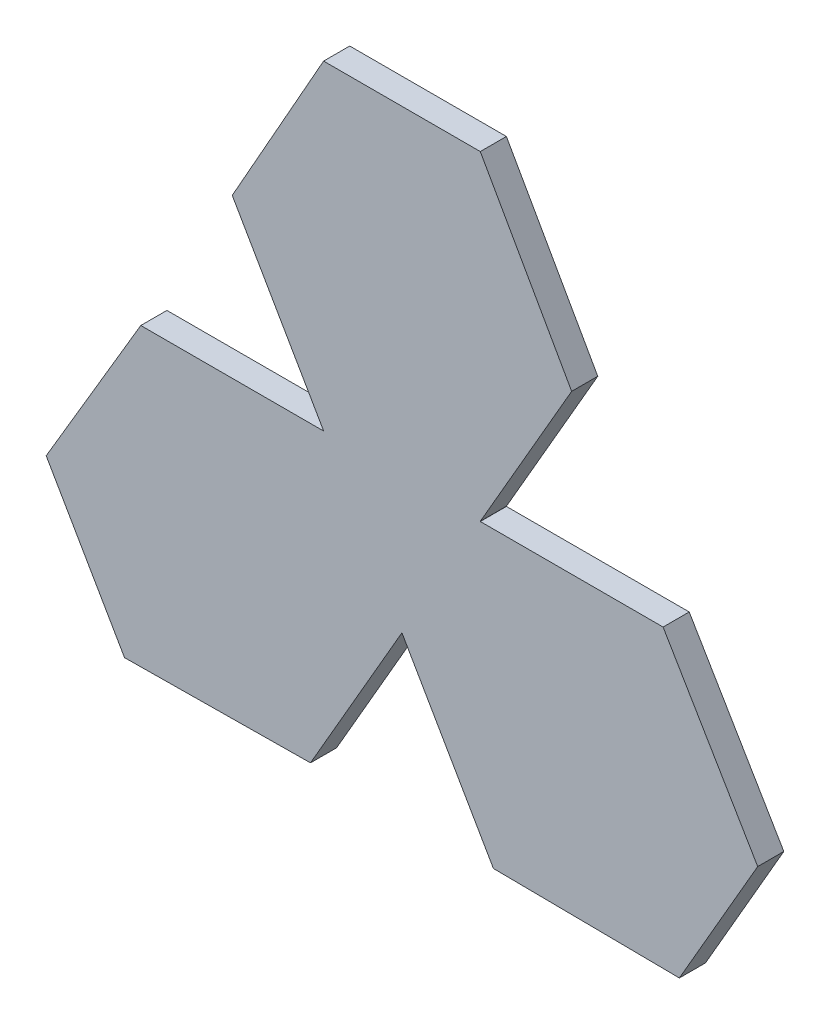
ISO-10303-21;
HEADER;
FILE_DESCRIPTION(('STEP AP214'),'2;1');
FILE_NAME('part.step','',(''),(''),'','','');
FILE_SCHEMA(('AUTOMOTIVE_DESIGN { 1 0 10303 214 1 1 1 1 }'));
ENDSEC;
DATA;
#1=APPLICATION_CONTEXT('core data for automotive mechanical design processes');
#2=APPLICATION_PROTOCOL_DEFINITION('international standard','automotive_design',2000,#1);
#3=PRODUCT_CONTEXT('',#1,'mechanical');
#4=PRODUCT('Part','Part','',(#3));
#5=PRODUCT_RELATED_PRODUCT_CATEGORY('part','',(#4));
#6=PRODUCT_DEFINITION_FORMATION('','',#4);
#7=PRODUCT_DEFINITION_CONTEXT('part definition',#1,'design');
#8=PRODUCT_DEFINITION('design','',#6,#7);
#9=PRODUCT_DEFINITION_SHAPE('','',#8);
#10=(LENGTH_UNIT() NAMED_UNIT(*) SI_UNIT(.MILLI.,.METRE.));
#11=(NAMED_UNIT(*) PLANE_ANGLE_UNIT() SI_UNIT($,.RADIAN.));
#12=(NAMED_UNIT(*) SI_UNIT($,.STERADIAN.) SOLID_ANGLE_UNIT());
#13=UNCERTAINTY_MEASURE_WITH_UNIT(LENGTH_MEASURE(1.E-05),#10,'distance_accuracy_value','');
#14=(GEOMETRIC_REPRESENTATION_CONTEXT(3) GLOBAL_UNCERTAINTY_ASSIGNED_CONTEXT((#13)) GLOBAL_UNIT_ASSIGNED_CONTEXT((#10,
#11,#12)) REPRESENTATION_CONTEXT('',''));
#15=CARTESIAN_POINT('',(0.,0.,0.));
#16=DIRECTION('',(0.,0.,1.));
#17=DIRECTION('',(1.,0.,0.));
#18=AXIS2_PLACEMENT_3D('',#15,#16,#17);
#19=CARTESIAN_POINT('',(-15.005,8.65159378380653,5.));
#20=DIRECTION('',(0.,-1.,0.));
#21=DIRECTION('',(1.,0.,0.));
#22=AXIS2_PLACEMENT_3D('',#19,#20,#21);
#23=PLANE('',#22);
#24=DIRECTION('',(-1.,0.,0.));
#25=VECTOR('',#24,1.);
#26=CARTESIAN_POINT('',(-15.005,8.65159378380653,0.));
#27=LINE('',#26,#25);
#28=CARTESIAN_POINT('',(-15.005,8.65159378380653,0.));
#29=VERTEX_POINT('',#28);
#30=CARTESIAN_POINT('',(-50.005,8.65159378380644,0.));
#31=VERTEX_POINT('',#30);
#32=EDGE_CURVE('E208',#29,#31,#27,.T.);
#33=ORIENTED_EDGE('',*,*,#32,.T.);
#34=DIRECTION('',(0.,0.,-1.));
#35=VECTOR('',#34,1.);
#36=CARTESIAN_POINT('',(-50.005,8.65159378380644,5.));
#37=LINE('',#36,#35);
#38=CARTESIAN_POINT('',(-50.005,8.65159378380644,5.));
#39=VERTEX_POINT('',#38);
#40=EDGE_CURVE('E52',#39,#31,#37,.T.);
#41=ORIENTED_EDGE('',*,*,#40,.F.);
#42=DIRECTION('',(-1.,0.,0.));
#43=VECTOR('',#42,1.);
#44=CARTESIAN_POINT('',(-15.005,8.65159378380653,5.));
#45=LINE('',#44,#43);
#46=CARTESIAN_POINT('',(-15.005,8.65159378380653,5.));
#47=VERTEX_POINT('',#46);
#48=EDGE_CURVE('E134',#47,#39,#45,.T.);
#49=ORIENTED_EDGE('',*,*,#48,.F.);
#50=DIRECTION('',(0.,0.,-1.));
#51=VECTOR('',#50,1.);
#52=CARTESIAN_POINT('',(-15.005,8.65159378380653,5.));
#53=LINE('',#52,#51);
#54=EDGE_CURVE('E11',#47,#29,#53,.T.);
#55=ORIENTED_EDGE('',*,*,#54,.T.);
#56=EDGE_LOOP('',(#33,#41,#49,#55));
#57=FACE_BOUND('',#56,.T.);
#58=ADVANCED_FACE('F43',(#57),#23,.F.);
#59=CARTESIAN_POINT('',(-50.005,8.65159378380644,5.));
#60=DIRECTION('',(0.860941421721352,-0.508704106887704,0.));
#61=DIRECTION('',(0.508704106887704,0.860941421721352,0.));
#62=AXIS2_PLACEMENT_3D('',#59,#60,#61);
#63=PLANE('',#62);
#64=DIRECTION('',(-0.508704106887704,-0.860941421721352,0.));
#65=VECTOR('',#64,1.);
#66=CARTESIAN_POINT('',(-50.005,8.65159378380644,0.));
#67=LINE('',#66,#65);
#68=CARTESIAN_POINT('',(-68.1217782649107,-22.0096189432335,0.));
#69=VERTEX_POINT('',#68);
#70=EDGE_CURVE('E211',#31,#69,#67,.T.);
#71=ORIENTED_EDGE('',*,*,#70,.T.);
#72=DIRECTION('',(0.,0.,-1.));
#73=VECTOR('',#72,1.);
#74=CARTESIAN_POINT('',(-68.1217782649107,-22.0096189432335,5.));
#75=LINE('',#74,#73);
#76=CARTESIAN_POINT('',(-68.1217782649107,-22.0096189432335,5.));
#77=VERTEX_POINT('',#76);
#78=EDGE_CURVE('E311',#77,#69,#75,.T.);
#79=ORIENTED_EDGE('',*,*,#78,.F.);
#80=DIRECTION('',(-0.508704106887704,-0.860941421721352,0.));
#81=VECTOR('',#80,1.);
#82=CARTESIAN_POINT('',(-50.005,8.65159378380644,5.));
#83=LINE('',#82,#81);
#84=EDGE_CURVE('E321',#39,#77,#83,.T.);
#85=ORIENTED_EDGE('',*,*,#84,.F.);
#86=ORIENTED_EDGE('',*,*,#40,.T.);
#87=EDGE_LOOP('',(#71,#79,#85,#86));
#88=FACE_BOUND('',#87,.T.);
#89=ADVANCED_FACE('F319',(#88),#63,.F.);
#90=CARTESIAN_POINT('',(-68.1217782649107,-22.0096189432335,5.));
#91=DIRECTION('',(0.866025403784438,0.5,0.));
#92=DIRECTION('',(-0.5,0.866025403784438,0.));
#93=AXIS2_PLACEMENT_3D('',#90,#91,#92);
#94=PLANE('',#93);
#95=DIRECTION('',(0.5,-0.866025403784438,0.));
#96=VECTOR('',#95,1.);
#97=CARTESIAN_POINT('',(-68.1217782649107,-22.0096189432335,0.));
#98=LINE('',#97,#96);
#99=CARTESIAN_POINT('',(-53.1217782649107,-47.9903810567666,0.));
#100=VERTEX_POINT('',#99);
#101=EDGE_CURVE('E214',#69,#100,#98,.T.);
#102=ORIENTED_EDGE('',*,*,#101,.T.);
#103=DIRECTION('',(0.,0.,-1.));
#104=VECTOR('',#103,1.);
#105=CARTESIAN_POINT('',(-53.1217782649107,-47.9903810567666,5.));
#106=LINE('',#105,#104);
#107=CARTESIAN_POINT('',(-53.1217782649107,-47.9903810567666,5.));
#108=VERTEX_POINT('',#107);
#109=EDGE_CURVE('E307',#108,#100,#106,.T.);
#110=ORIENTED_EDGE('',*,*,#109,.F.);
#111=DIRECTION('',(0.5,-0.866025403784438,0.));
#112=VECTOR('',#111,1.);
#113=CARTESIAN_POINT('',(-68.1217782649107,-22.0096189432335,5.));
#114=LINE('',#113,#112);
#115=EDGE_CURVE('E341',#77,#108,#114,.T.);
#116=ORIENTED_EDGE('',*,*,#115,.F.);
#117=ORIENTED_EDGE('',*,*,#78,.T.);
#118=EDGE_LOOP('',(#102,#110,#116,#117));
#119=FACE_BOUND('',#118,.T.);
#120=ADVANCED_FACE('F331',(#119),#94,.F.);
#121=CARTESIAN_POINT('',(-17.5100000000001,-47.6313972081441,5.));
#122=DIRECTION('',(-0.010079968713551,0.999949195824835,0.));
#123=DIRECTION('',(-0.999949195824835,-0.010079968713551,0.));
#124=AXIS2_PLACEMENT_3D('',#121,#122,#123);
#125=PLANE('',#124);
#126=DIRECTION('',(0.999949195824835,0.010079968713551,0.));
#127=VECTOR('',#126,1.);
#128=CARTESIAN_POINT('',(-17.5100000000001,-47.6313972081441,0.));
#129=LINE('',#128,#127);
#130=CARTESIAN_POINT('',(-17.5100000000001,-47.6313972081441,0.));
#131=VERTEX_POINT('',#130);
#132=EDGE_CURVE('E217',#100,#131,#129,.T.);
#133=ORIENTED_EDGE('',*,*,#132,.T.);
#134=DIRECTION('',(0.,0.,-1.));
#135=VECTOR('',#134,1.);
#136=CARTESIAN_POINT('',(-17.5100000000001,-47.6313972081441,5.));
#137=LINE('',#136,#135);
#138=CARTESIAN_POINT('',(-17.5100000000001,-47.6313972081441,5.));
#139=VERTEX_POINT('',#138);
#140=EDGE_CURVE('E303',#139,#131,#137,.T.);
#141=ORIENTED_EDGE('',*,*,#140,.F.);
#142=DIRECTION('',(0.999949195824835,0.010079968713551,0.));
#143=VECTOR('',#142,1.);
#144=CARTESIAN_POINT('',(-17.5100000000001,-47.6313972081441,5.));
#145=LINE('',#144,#143);
#146=EDGE_CURVE('E337',#108,#139,#145,.T.);
#147=ORIENTED_EDGE('',*,*,#146,.F.);
#148=ORIENTED_EDGE('',*,*,#109,.T.);
#149=EDGE_LOOP('',(#133,#141,#147,#148));
#150=FACE_BOUND('',#149,.T.);
#151=ADVANCED_FACE('F335',(#150),#125,.F.);
#152=CARTESIAN_POINT('',(-0.00999999999999439,-17.3205080756888,5.));
#153=DIRECTION('',(-0.866025403784438,0.500000000000002,0.));
#154=DIRECTION('',(-0.500000000000002,-0.866025403784438,0.));
#155=AXIS2_PLACEMENT_3D('',#152,#153,#154);
#156=PLANE('',#155);
#157=DIRECTION('',(0.500000000000002,0.866025403784438,0.));
#158=VECTOR('',#157,1.);
#159=CARTESIAN_POINT('',(-0.00999999999999439,-17.3205080756888,0.));
#160=LINE('',#159,#158);
#161=CARTESIAN_POINT('',(-0.00999999999999439,-17.3205080756888,0.));
#162=VERTEX_POINT('',#161);
#163=EDGE_CURVE('E220',#131,#162,#160,.T.);
#164=ORIENTED_EDGE('',*,*,#163,.T.);
#165=DIRECTION('',(0.,0.,-1.));
#166=VECTOR('',#165,1.);
#167=CARTESIAN_POINT('',(-0.00999999999999439,-17.3205080756888,5.));
#168=LINE('',#167,#166);
#169=CARTESIAN_POINT('',(-0.00999999999999439,-17.3205080756888,5.));
#170=VERTEX_POINT('',#169);
#171=EDGE_CURVE('E299',#170,#162,#168,.T.);
#172=ORIENTED_EDGE('',*,*,#171,.F.);
#173=DIRECTION('',(0.500000000000002,0.866025403784438,0.));
#174=VECTOR('',#173,1.);
#175=CARTESIAN_POINT('',(-0.00999999999999439,-17.3205080756888,5.));
#176=LINE('',#175,#174);
#177=EDGE_CURVE('E340',#139,#170,#176,.T.);
#178=ORIENTED_EDGE('',*,*,#177,.F.);
#179=ORIENTED_EDGE('',*,*,#140,.T.);
#180=EDGE_LOOP('',(#164,#172,#178,#179));
#181=FACE_BOUND('',#180,.T.);
#182=ADVANCED_FACE('F409',(#181),#156,.F.);
#183=CARTESIAN_POINT('',(0.,-17.3205080756888,5.));
#184=DIRECTION('',(0.,1.,0.));
#185=DIRECTION('',(0.,0.,1.));
#186=AXIS2_PLACEMENT_3D('',#183,#184,#185);
#187=PLANE('',#186);
#188=DIRECTION('',(1.,0.,0.));
#189=VECTOR('',#188,1.);
#190=CARTESIAN_POINT('',(0.,-17.3205080756888,0.));
#191=LINE('',#190,#189);
#192=CARTESIAN_POINT('',(0.0100000000000096,-17.3205080756888,0.));
#193=VERTEX_POINT('',#192);
#194=EDGE_CURVE('E224',#162,#193,#191,.T.);
#195=ORIENTED_EDGE('',*,*,#194,.T.);
#196=DIRECTION('',(0.,0.,-1.));
#197=VECTOR('',#196,1.);
#198=CARTESIAN_POINT('',(0.0100000000000096,-17.3205080756888,5.));
#199=LINE('',#198,#197);
#200=CARTESIAN_POINT('',(0.0100000000000096,-17.3205080756888,5.));
#201=VERTEX_POINT('',#200);
#202=EDGE_CURVE('E295',#201,#193,#199,.T.);
#203=ORIENTED_EDGE('',*,*,#202,.F.);
#204=DIRECTION('',(1.,-3.46944695195342E-13,0.));
#205=VECTOR('',#204,1.);
#206=CARTESIAN_POINT('',(0.,-17.3205080756888,5.));
#207=LINE('',#206,#205);
#208=EDGE_CURVE('E345',#170,#201,#207,.T.);
#209=ORIENTED_EDGE('',*,*,#208,.F.);
#210=ORIENTED_EDGE('',*,*,#171,.T.);
#211=EDGE_LOOP('',(#195,#203,#209,#210));
#212=FACE_BOUND('',#211,.T.);
#213=ADVANCED_FACE('F412',(#212),#187,.F.);
#214=CARTESIAN_POINT('',(0.0100000000000096,-17.3205080756888,5.));
#215=DIRECTION('',(0.866025403784437,0.500000000000002,0.));
#216=DIRECTION('',(-0.500000000000002,0.866025403784437,0.));
#217=AXIS2_PLACEMENT_3D('',#214,#215,#216);
#218=PLANE('',#217);
#219=DIRECTION('',(0.500000000000002,-0.866025403784437,0.));
#220=VECTOR('',#219,1.);
#221=CARTESIAN_POINT('',(0.0100000000000096,-17.3205080756888,0.));
#222=LINE('',#221,#220);
#223=CARTESIAN_POINT('',(17.5100000000001,-47.6313972081441,0.));
#224=VERTEX_POINT('',#223);
#225=EDGE_CURVE('E227',#193,#224,#222,.T.);
#226=ORIENTED_EDGE('',*,*,#225,.T.);
#227=DIRECTION('',(0.,0.,-1.));
#228=VECTOR('',#227,1.);
#229=CARTESIAN_POINT('',(17.5100000000001,-47.6313972081441,5.));
#230=LINE('',#229,#228);
#231=CARTESIAN_POINT('',(17.5100000000001,-47.6313972081441,5.));
#232=VERTEX_POINT('',#231);
#233=EDGE_CURVE('E291',#232,#224,#230,.T.);
#234=ORIENTED_EDGE('',*,*,#233,.F.);
#235=DIRECTION('',(0.500000000000002,-0.866025403784437,0.));
#236=VECTOR('',#235,1.);
#237=CARTESIAN_POINT('',(0.0100000000000096,-17.3205080756888,5.));
#238=LINE('',#237,#236);
#239=EDGE_CURVE('E352',#201,#232,#238,.T.);
#240=ORIENTED_EDGE('',*,*,#239,.F.);
#241=ORIENTED_EDGE('',*,*,#202,.T.);
#242=EDGE_LOOP('',(#226,#234,#240,#241));
#243=FACE_BOUND('',#242,.T.);
#244=ADVANCED_FACE('F416',(#243),#218,.F.);
#245=CARTESIAN_POINT('',(17.5100000000001,-47.6313972081441,5.));
#246=DIRECTION('',(0.0100799687135502,0.999949195824835,0.));
#247=DIRECTION('',(-0.999949195824835,0.0100799687135502,0.));
#248=AXIS2_PLACEMENT_3D('',#245,#246,#247);
#249=PLANE('',#248);
#250=DIRECTION('',(0.999949195824835,-0.0100799687135502,0.));
#251=VECTOR('',#250,1.);
#252=CARTESIAN_POINT('',(17.5100000000001,-47.6313972081441,0.));
#253=LINE('',#252,#251);
#254=CARTESIAN_POINT('',(53.1217782649108,-47.9903810567666,0.));
#255=VERTEX_POINT('',#254);
#256=EDGE_CURVE('E230',#224,#255,#253,.T.);
#257=ORIENTED_EDGE('',*,*,#256,.T.);
#258=DIRECTION('',(0.,0.,-1.));
#259=VECTOR('',#258,1.);
#260=CARTESIAN_POINT('',(53.1217782649108,-47.9903810567666,5.));
#261=LINE('',#260,#259);
#262=CARTESIAN_POINT('',(53.1217782649108,-47.9903810567666,5.));
#263=VERTEX_POINT('',#262);
#264=EDGE_CURVE('E287',#263,#255,#261,.T.);
#265=ORIENTED_EDGE('',*,*,#264,.F.);
#266=DIRECTION('',(0.999949195824835,-0.0100799687135502,0.));
#267=VECTOR('',#266,1.);
#268=CARTESIAN_POINT('',(17.5100000000001,-47.6313972081441,5.));
#269=LINE('',#268,#267);
#270=EDGE_CURVE('E355',#232,#263,#269,.T.);
#271=ORIENTED_EDGE('',*,*,#270,.F.);
#272=ORIENTED_EDGE('',*,*,#233,.T.);
#273=EDGE_LOOP('',(#257,#265,#271,#272));
#274=FACE_BOUND('',#273,.T.);
#275=ADVANCED_FACE('F420',(#274),#249,.F.);
#276=CARTESIAN_POINT('',(53.1217782649108,-47.9903810567666,5.));
#277=DIRECTION('',(-0.866025403784439,0.5,0.));
#278=DIRECTION('',(-0.5,-0.866025403784439,0.));
#279=AXIS2_PLACEMENT_3D('',#276,#277,#278);
#280=PLANE('',#279);
#281=DIRECTION('',(0.5,0.866025403784439,0.));
#282=VECTOR('',#281,1.);
#283=CARTESIAN_POINT('',(53.1217782649108,-47.9903810567666,0.));
#284=LINE('',#283,#282);
#285=CARTESIAN_POINT('',(68.1217782649108,-22.0096189432334,0.));
#286=VERTEX_POINT('',#285);
#287=EDGE_CURVE('E233',#255,#286,#284,.T.);
#288=ORIENTED_EDGE('',*,*,#287,.T.);
#289=DIRECTION('',(0.,0.,-1.));
#290=VECTOR('',#289,1.);
#291=CARTESIAN_POINT('',(68.1217782649108,-22.0096189432334,5.));
#292=LINE('',#291,#290);
#293=CARTESIAN_POINT('',(68.1217782649108,-22.0096189432334,5.));
#294=VERTEX_POINT('',#293);
#295=EDGE_CURVE('E283',#294,#286,#292,.T.);
#296=ORIENTED_EDGE('',*,*,#295,.F.);
#297=DIRECTION('',(0.5,0.866025403784439,0.));
#298=VECTOR('',#297,1.);
#299=CARTESIAN_POINT('',(53.1217782649108,-47.9903810567666,5.));
#300=LINE('',#299,#298);
#301=EDGE_CURVE('E358',#263,#294,#300,.T.);
#302=ORIENTED_EDGE('',*,*,#301,.F.);
#303=ORIENTED_EDGE('',*,*,#264,.T.);
#304=EDGE_LOOP('',(#288,#296,#302,#303));
#305=FACE_BOUND('',#304,.T.);
#306=ADVANCED_FACE('F424',(#305),#280,.F.);
#307=CARTESIAN_POINT('',(50.005,8.65159378380647,5.));
#308=DIRECTION('',(-0.860941421721352,-0.508704106887705,0.));
#309=DIRECTION('',(0.508704106887705,-0.860941421721352,0.));
#310=AXIS2_PLACEMENT_3D('',#307,#308,#309);
#311=PLANE('',#310);
#312=DIRECTION('',(-0.508704106887705,0.860941421721352,0.));
#313=VECTOR('',#312,1.);
#314=CARTESIAN_POINT('',(50.005,8.65159378380647,0.));
#315=LINE('',#314,#313);
#316=CARTESIAN_POINT('',(50.005,8.65159378380647,0.));
#317=VERTEX_POINT('',#316);
#318=EDGE_CURVE('E236',#286,#317,#315,.T.);
#319=ORIENTED_EDGE('',*,*,#318,.T.);
#320=DIRECTION('',(0.,0.,-1.));
#321=VECTOR('',#320,1.);
#322=CARTESIAN_POINT('',(50.005,8.65159378380647,5.));
#323=LINE('',#322,#321);
#324=CARTESIAN_POINT('',(50.005,8.65159378380647,5.));
#325=VERTEX_POINT('',#324);
#326=EDGE_CURVE('E279',#325,#317,#323,.T.);
#327=ORIENTED_EDGE('',*,*,#326,.F.);
#328=DIRECTION('',(-0.508704106887705,0.860941421721352,0.));
#329=VECTOR('',#328,1.);
#330=CARTESIAN_POINT('',(50.005,8.65159378380647,5.));
#331=LINE('',#330,#329);
#332=EDGE_CURVE('E361',#294,#325,#331,.T.);
#333=ORIENTED_EDGE('',*,*,#332,.F.);
#334=ORIENTED_EDGE('',*,*,#295,.T.);
#335=EDGE_LOOP('',(#319,#327,#333,#334));
#336=FACE_BOUND('',#335,.T.);
#337=ADVANCED_FACE('F428',(#336),#311,.F.);
#338=CARTESIAN_POINT('',(15.005,8.65159378380654,5.));
#339=DIRECTION('',(0.,-1.,0.));
#340=DIRECTION('',(1.,0.,0.));
#341=AXIS2_PLACEMENT_3D('',#338,#339,#340);
#342=PLANE('',#341);
#343=DIRECTION('',(-1.,0.,0.));
#344=VECTOR('',#343,1.);
#345=CARTESIAN_POINT('',(15.005,8.65159378380654,0.));
#346=LINE('',#345,#344);
#347=CARTESIAN_POINT('',(15.005,8.65159378380654,0.));
#348=VERTEX_POINT('',#347);
#349=EDGE_CURVE('E239',#317,#348,#346,.T.);
#350=ORIENTED_EDGE('',*,*,#349,.T.);
#351=DIRECTION('',(0.,0.,-1.));
#352=VECTOR('',#351,1.);
#353=CARTESIAN_POINT('',(15.005,8.65159378380654,5.));
#354=LINE('',#353,#352);
#355=CARTESIAN_POINT('',(15.005,8.65159378380654,5.));
#356=VERTEX_POINT('',#355);
#357=EDGE_CURVE('E275',#356,#348,#354,.T.);
#358=ORIENTED_EDGE('',*,*,#357,.F.);
#359=DIRECTION('',(-1.,0.,0.));
#360=VECTOR('',#359,1.);
#361=CARTESIAN_POINT('',(15.005,8.65159378380654,5.));
#362=LINE('',#361,#360);
#363=EDGE_CURVE('E364',#325,#356,#362,.T.);
#364=ORIENTED_EDGE('',*,*,#363,.F.);
#365=ORIENTED_EDGE('',*,*,#326,.T.);
#366=EDGE_LOOP('',(#350,#358,#364,#365));
#367=FACE_BOUND('',#366,.T.);
#368=ADVANCED_FACE('F432',(#367),#342,.F.);
#369=CARTESIAN_POINT('',(15.,8.66025403784438,5.));
#370=DIRECTION('',(-0.866025403784566,-0.49999999999978,0.));
#371=DIRECTION('',(0.49999999999978,-0.866025403784566,0.));
#372=AXIS2_PLACEMENT_3D('',#369,#370,#371);
#373=PLANE('',#372);
#374=DIRECTION('',(-0.49999999999978,0.866025403784566,0.));
#375=VECTOR('',#374,1.);
#376=CARTESIAN_POINT('',(15.,8.66025403784438,0.));
#377=LINE('',#376,#375);
#378=CARTESIAN_POINT('',(14.995,8.66891429188223,0.));
#379=VERTEX_POINT('',#378);
#380=EDGE_CURVE('E243',#348,#379,#377,.T.);
#381=ORIENTED_EDGE('',*,*,#380,.T.);
#382=DIRECTION('',(0.,0.,-1.));
#383=VECTOR('',#382,1.);
#384=CARTESIAN_POINT('',(14.995,8.66891429188223,5.));
#385=LINE('',#384,#383);
#386=CARTESIAN_POINT('',(14.995,8.66891429188223,5.));
#387=VERTEX_POINT('',#386);
#388=EDGE_CURVE('E271',#387,#379,#385,.T.);
#389=ORIENTED_EDGE('',*,*,#388,.F.);
#390=DIRECTION('',(-0.50000000000025,0.866025403784294,0.));
#391=VECTOR('',#390,1.);
#392=CARTESIAN_POINT('',(15.,8.66025403784438,5.));
#393=LINE('',#392,#391);
#394=EDGE_CURVE('E367',#356,#387,#393,.T.);
#395=ORIENTED_EDGE('',*,*,#394,.F.);
#396=ORIENTED_EDGE('',*,*,#357,.T.);
#397=EDGE_LOOP('',(#381,#389,#395,#396));
#398=FACE_BOUND('',#397,.T.);
#399=ADVANCED_FACE('F436',(#398),#373,.F.);
#400=CARTESIAN_POINT('',(14.995,8.66891429188223,5.));
#401=DIRECTION('',(-0.86602540378444,0.499999999999998,0.));
#402=DIRECTION('',(-0.499999999999998,-0.86602540378444,0.));
#403=AXIS2_PLACEMENT_3D('',#400,#401,#402);
#404=PLANE('',#403);
#405=DIRECTION('',(0.499999999999998,0.86602540378444,0.));
#406=VECTOR('',#405,1.);
#407=CARTESIAN_POINT('',(14.995,8.66891429188223,0.));
#408=LINE('',#407,#406);
#409=CARTESIAN_POINT('',(32.4949999999999,38.9798034243376,0.));
#410=VERTEX_POINT('',#409);
#411=EDGE_CURVE('E246',#379,#410,#408,.T.);
#412=ORIENTED_EDGE('',*,*,#411,.T.);
#413=DIRECTION('',(0.,0.,-1.));
#414=VECTOR('',#413,1.);
#415=CARTESIAN_POINT('',(32.4949999999999,38.9798034243376,5.));
#416=LINE('',#415,#414);
#417=CARTESIAN_POINT('',(32.4949999999999,38.9798034243376,5.));
#418=VERTEX_POINT('',#417);
#419=EDGE_CURVE('E267',#418,#410,#416,.T.);
#420=ORIENTED_EDGE('',*,*,#419,.F.);
#421=DIRECTION('',(0.499999999999998,0.86602540378444,0.));
#422=VECTOR('',#421,1.);
#423=CARTESIAN_POINT('',(14.995,8.66891429188223,5.));
#424=LINE('',#423,#422);
#425=EDGE_CURVE('E370',#387,#418,#424,.T.);
#426=ORIENTED_EDGE('',*,*,#425,.F.);
#427=ORIENTED_EDGE('',*,*,#388,.T.);
#428=EDGE_LOOP('',(#412,#420,#426,#427));
#429=FACE_BOUND('',#428,.T.);
#430=ADVANCED_FACE('F378',(#429),#404,.F.);
#431=CARTESIAN_POINT('',(32.4949999999999,38.9798034243376,5.));
#432=DIRECTION('',(-0.871021390434902,-0.49124508893713,0.));
#433=DIRECTION('',(0.49124508893713,-0.871021390434902,0.));
#434=AXIS2_PLACEMENT_3D('',#431,#432,#433);
#435=PLANE('',#434);
#436=DIRECTION('',(-0.49124508893713,0.871021390434902,0.));
#437=VECTOR('',#436,1.);
#438=CARTESIAN_POINT('',(32.4949999999999,38.9798034243376,0.));
#439=LINE('',#438,#437);
#440=CARTESIAN_POINT('',(15.,70.,0.));
#441=VERTEX_POINT('',#440);
#442=EDGE_CURVE('E249',#410,#441,#439,.T.);
#443=ORIENTED_EDGE('',*,*,#442,.T.);
#444=DIRECTION('',(0.,0.,-1.));
#445=VECTOR('',#444,1.);
#446=CARTESIAN_POINT('',(15.,70.,5.));
#447=LINE('',#446,#445);
#448=CARTESIAN_POINT('',(15.,70.,5.));
#449=VERTEX_POINT('',#448);
#450=EDGE_CURVE('E195',#449,#441,#447,.T.);
#451=ORIENTED_EDGE('',*,*,#450,.F.);
#452=DIRECTION('',(-0.49124508893713,0.871021390434902,0.));
#453=VECTOR('',#452,1.);
#454=CARTESIAN_POINT('',(32.4949999999999,38.9798034243376,5.));
#455=LINE('',#454,#453);
#456=EDGE_CURVE('E184',#418,#449,#455,.T.);
#457=ORIENTED_EDGE('',*,*,#456,.F.);
#458=ORIENTED_EDGE('',*,*,#419,.T.);
#459=EDGE_LOOP('',(#443,#451,#457,#458));
#460=FACE_BOUND('',#459,.T.);
#461=ADVANCED_FACE('F382',(#460),#435,.F.);
#462=CARTESIAN_POINT('',(15.,70.,5.));
#463=DIRECTION('',(0.,-1.,0.));
#464=DIRECTION('',(0.,0.,-1.));
#465=AXIS2_PLACEMENT_3D('',#462,#463,#464);
#466=PLANE('',#465);
#467=DIRECTION('',(-1.,0.,0.));
#468=VECTOR('',#467,1.);
#469=CARTESIAN_POINT('',(15.,70.,0.));
#470=LINE('',#469,#468);
#471=CARTESIAN_POINT('',(-15.,70.,0.));
#472=VERTEX_POINT('',#471);
#473=EDGE_CURVE('E193',#441,#472,#470,.T.);
#474=ORIENTED_EDGE('',*,*,#473,.T.);
#475=DIRECTION('',(0.,0.,-1.));
#476=VECTOR('',#475,1.);
#477=CARTESIAN_POINT('',(-15.,70.,5.));
#478=LINE('',#477,#476);
#479=CARTESIAN_POINT('',(-15.,70.,5.));
#480=VERTEX_POINT('',#479);
#481=EDGE_CURVE('E190',#480,#472,#478,.T.);
#482=ORIENTED_EDGE('',*,*,#481,.F.);
#483=DIRECTION('',(-1.,0.,0.));
#484=VECTOR('',#483,1.);
#485=CARTESIAN_POINT('',(15.,70.,5.));
#486=LINE('',#485,#484);
#487=EDGE_CURVE('E178',#449,#480,#486,.T.);
#488=ORIENTED_EDGE('',*,*,#487,.F.);
#489=ORIENTED_EDGE('',*,*,#450,.T.);
#490=EDGE_LOOP('',(#474,#482,#488,#489));
#491=FACE_BOUND('',#490,.T.);
#492=ADVANCED_FACE('F191',(#491),#466,.F.);
#493=CARTESIAN_POINT('',(-32.4949999999999,38.9798034243376,5.));
#494=DIRECTION('',(0.871021390434902,-0.491245088937131,0.));
#495=DIRECTION('',(0.491245088937131,0.871021390434902,0.));
#496=AXIS2_PLACEMENT_3D('',#493,#494,#495);
#497=PLANE('',#496);
#498=DIRECTION('',(-0.491245088937131,-0.871021390434902,0.));
#499=VECTOR('',#498,1.);
#500=CARTESIAN_POINT('',(-32.4949999999999,38.9798034243376,0.));
#501=LINE('',#500,#499);
#502=CARTESIAN_POINT('',(-32.4949999999999,38.9798034243376,0.));
#503=VERTEX_POINT('',#502);
#504=EDGE_CURVE('E120',#472,#503,#501,.T.);
#505=ORIENTED_EDGE('',*,*,#504,.T.);
#506=DIRECTION('',(0.,0.,-1.));
#507=VECTOR('',#506,1.);
#508=CARTESIAN_POINT('',(-32.4949999999999,38.9798034243376,5.));
#509=LINE('',#508,#507);
#510=CARTESIAN_POINT('',(-32.4949999999999,38.9798034243376,5.));
#511=VERTEX_POINT('',#510);
#512=EDGE_CURVE('E196',#511,#503,#509,.T.);
#513=ORIENTED_EDGE('',*,*,#512,.F.);
#514=DIRECTION('',(-0.491245088937131,-0.871021390434902,0.));
#515=VECTOR('',#514,1.);
#516=CARTESIAN_POINT('',(-32.4949999999999,38.9798034243376,5.));
#517=LINE('',#516,#515);
#518=EDGE_CURVE('E182',#480,#511,#517,.T.);
#519=ORIENTED_EDGE('',*,*,#518,.F.);
#520=ORIENTED_EDGE('',*,*,#481,.T.);
#521=EDGE_LOOP('',(#505,#513,#519,#520));
#522=FACE_BOUND('',#521,.T.);
#523=ADVANCED_FACE('F198',(#522),#497,.F.);
#524=CARTESIAN_POINT('',(-14.995,8.66891429188223,5.));
#525=DIRECTION('',(0.86602540378444,0.499999999999998,0.));
#526=DIRECTION('',(-0.499999999999998,0.86602540378444,0.));
#527=AXIS2_PLACEMENT_3D('',#524,#525,#526);
#528=PLANE('',#527);
#529=DIRECTION('',(0.499999999999998,-0.86602540378444,0.));
#530=VECTOR('',#529,1.);
#531=CARTESIAN_POINT('',(-14.995,8.66891429188223,0.));
#532=LINE('',#531,#530);
#533=CARTESIAN_POINT('',(-14.995,8.66891429188223,0.));
#534=VERTEX_POINT('',#533);
#535=EDGE_CURVE('E127',#503,#534,#532,.T.);
#536=ORIENTED_EDGE('',*,*,#535,.T.);
#537=DIRECTION('',(0.,0.,-1.));
#538=VECTOR('',#537,1.);
#539=CARTESIAN_POINT('',(-14.995,8.66891429188223,5.));
#540=LINE('',#539,#538);
#541=CARTESIAN_POINT('',(-14.995,8.66891429188223,5.));
#542=VERTEX_POINT('',#541);
#543=EDGE_CURVE('E204',#542,#534,#540,.T.);
#544=ORIENTED_EDGE('',*,*,#543,.F.);
#545=DIRECTION('',(0.499999999999998,-0.86602540378444,0.));
#546=VECTOR('',#545,1.);
#547=CARTESIAN_POINT('',(-14.995,8.66891429188223,5.));
#548=LINE('',#547,#546);
#549=EDGE_CURVE('E201',#511,#542,#548,.T.);
#550=ORIENTED_EDGE('',*,*,#549,.F.);
#551=ORIENTED_EDGE('',*,*,#512,.T.);
#552=EDGE_LOOP('',(#536,#544,#550,#551));
#553=FACE_BOUND('',#552,.T.);
#554=ADVANCED_FACE('F384',(#553),#528,.F.);
#555=CARTESIAN_POINT('',(-15.,8.66025403784438,5.));
#556=DIRECTION('',(0.866025403784566,-0.49999999999978,0.));
#557=DIRECTION('',(0.49999999999978,0.866025403784566,0.));
#558=AXIS2_PLACEMENT_3D('',#555,#556,#557);
#559=PLANE('',#558);
#560=DIRECTION('',(-0.49999999999978,-0.866025403784566,0.));
#561=VECTOR('',#560,1.);
#562=CARTESIAN_POINT('',(-15.,8.66025403784438,0.));
#563=LINE('',#562,#561);
#564=EDGE_CURVE('E258',#534,#29,#563,.T.);
#565=ORIENTED_EDGE('',*,*,#564,.T.);
#566=ORIENTED_EDGE('',*,*,#54,.F.);
#567=DIRECTION('',(-0.50000000000032,-0.866025403784254,0.));
#568=VECTOR('',#567,1.);
#569=CARTESIAN_POINT('',(-15.,8.66025403784438,5.));
#570=LINE('',#569,#568);
#571=EDGE_CURVE('E60',#542,#47,#570,.T.);
#572=ORIENTED_EDGE('',*,*,#571,.F.);
#573=ORIENTED_EDGE('',*,*,#543,.T.);
#574=EDGE_LOOP('',(#565,#566,#572,#573));
#575=FACE_BOUND('',#574,.T.);
#576=ADVANCED_FACE('F383',(#575),#559,.F.);
#577=CARTESIAN_POINT('',(0.,0.,5.));
#578=DIRECTION('',(0.,0.,1.));
#579=DIRECTION('',(1.,0.,0.));
#580=AXIS2_PLACEMENT_3D('',#577,#578,#579);
#581=PLANE('',#580);
#582=ORIENTED_EDGE('',*,*,#571,.T.);
#583=ORIENTED_EDGE('',*,*,#48,.T.);
#584=ORIENTED_EDGE('',*,*,#84,.T.);
#585=ORIENTED_EDGE('',*,*,#115,.T.);
#586=ORIENTED_EDGE('',*,*,#146,.T.);
#587=ORIENTED_EDGE('',*,*,#177,.T.);
#588=ORIENTED_EDGE('',*,*,#208,.T.);
#589=ORIENTED_EDGE('',*,*,#239,.T.);
#590=ORIENTED_EDGE('',*,*,#270,.T.);
#591=ORIENTED_EDGE('',*,*,#301,.T.);
#592=ORIENTED_EDGE('',*,*,#332,.T.);
#593=ORIENTED_EDGE('',*,*,#363,.T.);
#594=ORIENTED_EDGE('',*,*,#394,.T.);
#595=ORIENTED_EDGE('',*,*,#425,.T.);
#596=ORIENTED_EDGE('',*,*,#456,.T.);
#597=ORIENTED_EDGE('',*,*,#487,.T.);
#598=ORIENTED_EDGE('',*,*,#518,.T.);
#599=ORIENTED_EDGE('',*,*,#549,.T.);
#600=EDGE_LOOP('',(#582,#583,#584,#585,#586,#587,#588,#589,#590,#591,#592,#593,#594,#595,#596,
#597,#598,#599));
#601=FACE_BOUND('',#600,.T.);
#602=ADVANCED_FACE('F180',(#601),#581,.T.);
#603=CARTESIAN_POINT('',(0.,0.,0.));
#604=DIRECTION('',(0.,0.,1.));
#605=DIRECTION('',(1.,0.,0.));
#606=AXIS2_PLACEMENT_3D('',#603,#604,#605);
#607=PLANE('',#606);
#608=ORIENTED_EDGE('',*,*,#32,.F.);
#609=ORIENTED_EDGE('',*,*,#564,.F.);
#610=ORIENTED_EDGE('',*,*,#535,.F.);
#611=ORIENTED_EDGE('',*,*,#504,.F.);
#612=ORIENTED_EDGE('',*,*,#473,.F.);
#613=ORIENTED_EDGE('',*,*,#442,.F.);
#614=ORIENTED_EDGE('',*,*,#411,.F.);
#615=ORIENTED_EDGE('',*,*,#380,.F.);
#616=ORIENTED_EDGE('',*,*,#349,.F.);
#617=ORIENTED_EDGE('',*,*,#318,.F.);
#618=ORIENTED_EDGE('',*,*,#287,.F.);
#619=ORIENTED_EDGE('',*,*,#256,.F.);
#620=ORIENTED_EDGE('',*,*,#225,.F.);
#621=ORIENTED_EDGE('',*,*,#194,.F.);
#622=ORIENTED_EDGE('',*,*,#163,.F.);
#623=ORIENTED_EDGE('',*,*,#132,.F.);
#624=ORIENTED_EDGE('',*,*,#101,.F.);
#625=ORIENTED_EDGE('',*,*,#70,.F.);
#626=EDGE_LOOP('',(#608,#609,#610,#611,#612,#613,#614,#615,#616,#617,#618,#619,#620,#621,#622,
#623,#624,#625));
#627=FACE_BOUND('',#626,.T.);
#628=ADVANCED_FACE('F325',(#627),#607,.F.);
#629=CLOSED_SHELL('',(#58,#89,#120,#151,#182,#213,#244,#275,#306,#337,#368,#399,#430,#461,#492,
#523,#554,#576,#602,#628));
#630=MANIFOLD_SOLID_BREP('B2',#629);
#631=ADVANCED_BREP_SHAPE_REPRESENTATION('',(#18,#630),#14);
#632=SHAPE_DEFINITION_REPRESENTATION(#9,#631);
ENDSEC;
END-ISO-10303-21;
